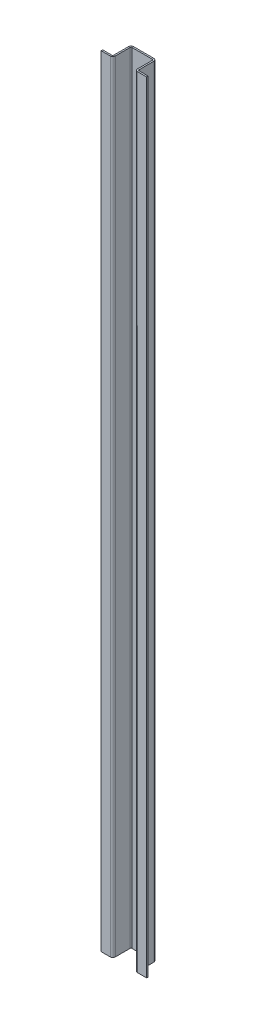
ISO-10303-21;
HEADER;
FILE_DESCRIPTION(('STEP AP214'),'2;1');
FILE_NAME('part.step','',(''),(''),'','','');
FILE_SCHEMA(('AUTOMOTIVE_DESIGN { 1 0 10303 214 1 1 1 1 }'));
ENDSEC;
DATA;
#1=APPLICATION_CONTEXT('core data for automotive mechanical design processes');
#2=APPLICATION_PROTOCOL_DEFINITION('international standard','automotive_design',2000,#1);
#3=PRODUCT_CONTEXT('',#1,'mechanical');
#4=PRODUCT('Part','Part','',(#3));
#5=PRODUCT_RELATED_PRODUCT_CATEGORY('part','',(#4));
#6=PRODUCT_DEFINITION_FORMATION('','',#4);
#7=PRODUCT_DEFINITION_CONTEXT('part definition',#1,'design');
#8=PRODUCT_DEFINITION('design','',#6,#7);
#9=PRODUCT_DEFINITION_SHAPE('','',#8);
#10=(LENGTH_UNIT() NAMED_UNIT(*) SI_UNIT(.MILLI.,.METRE.));
#11=(NAMED_UNIT(*) PLANE_ANGLE_UNIT() SI_UNIT($,.RADIAN.));
#12=(NAMED_UNIT(*) SI_UNIT($,.STERADIAN.) SOLID_ANGLE_UNIT());
#13=UNCERTAINTY_MEASURE_WITH_UNIT(LENGTH_MEASURE(1.E-05),#10,'distance_accuracy_value','');
#14=(GEOMETRIC_REPRESENTATION_CONTEXT(3) GLOBAL_UNCERTAINTY_ASSIGNED_CONTEXT((#13)) GLOBAL_UNIT_ASSIGNED_CONTEXT((#10,
#11,#12)) REPRESENTATION_CONTEXT('',''));
#15=CARTESIAN_POINT('',(0.,0.,0.));
#16=DIRECTION('',(0.,0.,1.));
#17=DIRECTION('',(1.,0.,0.));
#18=AXIS2_PLACEMENT_3D('',#15,#16,#17);
#19=CARTESIAN_POINT('',(-263.,95.4999999999986,-1542.6051229556));
#20=DIRECTION('',(1.,0.,0.));
#21=DIRECTION('',(0.,0.,-1.));
#22=AXIS2_PLACEMENT_3D('',#19,#20,#21);
#23=PLANE('',#22);
#24=DIRECTION('',(0.,0.,1.));
#25=VECTOR('',#24,1.);
#26=CARTESIAN_POINT('',(-263.,865.999999999998,-1542.6051229556));
#27=LINE('',#26,#25);
#28=CARTESIAN_POINT('',(-263.,865.999999999998,-3.00000000000011));
#29=VERTEX_POINT('',#28);
#30=CARTESIAN_POINT('',(-263.,865.999999999998,-1.50000000000061));
#31=VERTEX_POINT('',#30);
#32=EDGE_CURVE('E327',#29,#31,#27,.T.);
#33=ORIENTED_EDGE('',*,*,#32,.T.);
#34=DIRECTION('',(0.,1.,0.));
#35=VECTOR('',#34,1.);
#36=CARTESIAN_POINT('',(-263.,95.4999999999986,-1.50000000000011));
#37=LINE('',#36,#35);
#38=CARTESIAN_POINT('',(-263.,95.4999999999986,-1.50000000000061));
#39=VERTEX_POINT('',#38);
#40=EDGE_CURVE('E81',#39,#31,#37,.T.);
#41=ORIENTED_EDGE('',*,*,#40,.F.);
#42=DIRECTION('',(0.,0.,1.));
#43=VECTOR('',#42,1.);
#44=CARTESIAN_POINT('',(-263.,95.4999999999986,-1542.6051229556));
#45=LINE('',#44,#43);
#46=CARTESIAN_POINT('',(-263.,95.4999999999986,-3.00000000000011));
#47=VERTEX_POINT('',#46);
#48=EDGE_CURVE('E316',#47,#39,#45,.T.);
#49=ORIENTED_EDGE('',*,*,#48,.F.);
#50=DIRECTION('',(0.,1.,0.));
#51=VECTOR('',#50,1.);
#52=CARTESIAN_POINT('',(-263.,95.4999999999986,-3.00000000000011));
#53=LINE('',#52,#51);
#54=EDGE_CURVE('E325',#47,#29,#53,.T.);
#55=ORIENTED_EDGE('',*,*,#54,.T.);
#56=EDGE_LOOP('',(#33,#41,#49,#55));
#57=FACE_BOUND('',#56,.T.);
#58=ADVANCED_FACE('F42',(#57),#23,.T.);
#59=CARTESIAN_POINT('',(-263.,865.999999999999,-1542.6051229556));
#60=DIRECTION('',(0.,-1.,0.));
#61=DIRECTION('',(0.,0.,-1.));
#62=AXIS2_PLACEMENT_3D('',#59,#60,#61);
#63=PLANE('',#62);
#64=DIRECTION('',(1.,0.,0.));
#65=VECTOR('',#64,1.);
#66=CARTESIAN_POINT('',(-263.,865.999999999999,-1.50000000000011));
#67=LINE('',#66,#65);
#68=CARTESIAN_POINT('',(-272.,865.999999999999,-1.50000000000014));
#69=VERTEX_POINT('',#68);
#70=EDGE_CURVE('E74',#31,#69,#67,.F.);
#71=ORIENTED_EDGE('',*,*,#70,.F.);
#72=ORIENTED_EDGE('',*,*,#32,.F.);
#73=DIRECTION('',(1.,0.,0.));
#74=VECTOR('',#73,1.);
#75=CARTESIAN_POINT('',(-263.,865.999999999999,-3.00000000000011));
#76=LINE('',#75,#74);
#77=CARTESIAN_POINT('',(-272.,865.999999999999,-3.00000000000014));
#78=VERTEX_POINT('',#77);
#79=EDGE_CURVE('E11',#78,#29,#76,.T.);
#80=ORIENTED_EDGE('',*,*,#79,.F.);
#81=DIRECTION('',(0.,0.,1.));
#82=VECTOR('',#81,1.);
#83=CARTESIAN_POINT('',(-272.,865.999999999999,-1542.6051229556));
#84=LINE('',#83,#82);
#85=EDGE_CURVE('E323',#78,#69,#84,.T.);
#86=ORIENTED_EDGE('',*,*,#85,.T.);
#87=EDGE_LOOP('',(#71,#72,#80,#86));
#88=FACE_BOUND('',#87,.T.);
#89=ADVANCED_FACE('F337',(#88),#63,.F.);
#90=CARTESIAN_POINT('',(-273.,95.4999999999986,-1.50000000000011));
#91=DIRECTION('',(0.,0.,1.));
#92=DIRECTION('',(1.,0.,0.));
#93=AXIS2_PLACEMENT_3D('',#90,#91,#92);
#94=PLANE('',#93);
#95=ORIENTED_EDGE('',*,*,#70,.T.);
#96=DIRECTION('',(0.,1.,0.));
#97=VECTOR('',#96,1.);
#98=CARTESIAN_POINT('',(-272.,95.4999999999986,-1.50000000000011));
#99=LINE('',#98,#97);
#100=CARTESIAN_POINT('',(-272.,95.4999999999986,-1.50000000000061));
#101=VERTEX_POINT('',#100);
#102=EDGE_CURVE('E319',#69,#101,#99,.F.);
#103=ORIENTED_EDGE('',*,*,#102,.T.);
#104=DIRECTION('',(1.,0.,0.));
#105=VECTOR('',#104,1.);
#106=CARTESIAN_POINT('',(-274.5,95.4999999999986,-1.50000000000011));
#107=LINE('',#106,#105);
#108=EDGE_CURVE('E314',#39,#101,#107,.F.);
#109=ORIENTED_EDGE('',*,*,#108,.F.);
#110=ORIENTED_EDGE('',*,*,#40,.T.);
#111=EDGE_LOOP('',(#95,#103,#109,#110));
#112=FACE_BOUND('',#111,.T.);
#113=ADVANCED_FACE('F339',(#112),#94,.T.);
#114=CARTESIAN_POINT('',(-274.5,95.4999999999986,-1542.6051229556));
#115=DIRECTION('',(0.,-1.,0.));
#116=DIRECTION('',(0.,0.,-1.));
#117=AXIS2_PLACEMENT_3D('',#114,#115,#116);
#118=PLANE('',#117);
#119=ORIENTED_EDGE('',*,*,#48,.T.);
#120=ORIENTED_EDGE('',*,*,#108,.T.);
#121=DIRECTION('',(0.,0.,1.));
#122=VECTOR('',#121,1.);
#123=CARTESIAN_POINT('',(-272.,95.4999999999986,-1542.6051229556));
#124=LINE('',#123,#122);
#125=CARTESIAN_POINT('',(-272.,95.4999999999986,-3.00000000000014));
#126=VERTEX_POINT('',#125);
#127=EDGE_CURVE('E261',#126,#101,#124,.T.);
#128=ORIENTED_EDGE('',*,*,#127,.F.);
#129=DIRECTION('',(1.,0.,0.));
#130=VECTOR('',#129,1.);
#131=CARTESIAN_POINT('',(-274.5,95.4999999999986,-3.00000000000011));
#132=LINE('',#131,#130);
#133=EDGE_CURVE('E52',#126,#47,#132,.T.);
#134=ORIENTED_EDGE('',*,*,#133,.T.);
#135=EDGE_LOOP('',(#119,#120,#128,#134));
#136=FACE_BOUND('',#135,.T.);
#137=ADVANCED_FACE('F335',(#136),#118,.T.);
#138=CARTESIAN_POINT('',(-273.,95.4999999999986,-3.00000000000011));
#139=DIRECTION('',(0.,0.,1.));
#140=DIRECTION('',(1.,0.,0.));
#141=AXIS2_PLACEMENT_3D('',#138,#139,#140);
#142=PLANE('',#141);
#143=ORIENTED_EDGE('',*,*,#54,.F.);
#144=ORIENTED_EDGE('',*,*,#133,.F.);
#145=DIRECTION('',(0.,1.,0.));
#146=VECTOR('',#145,1.);
#147=CARTESIAN_POINT('',(-272.,95.4999999999986,-3.00000000000011));
#148=LINE('',#147,#146);
#149=EDGE_CURVE('E46',#78,#126,#148,.F.);
#150=ORIENTED_EDGE('',*,*,#149,.F.);
#151=ORIENTED_EDGE('',*,*,#79,.T.);
#152=EDGE_LOOP('',(#143,#144,#150,#151));
#153=FACE_BOUND('',#152,.T.);
#154=ADVANCED_FACE('F44',(#153),#142,.F.);
#155=CARTESIAN_POINT('',(-308.,95.4999999999986,-1542.6051229556));
#156=DIRECTION('',(-1.,0.,0.));
#157=DIRECTION('',(0.,0.,1.));
#158=AXIS2_PLACEMENT_3D('',#155,#156,#157);
#159=PLANE('',#158);
#160=DIRECTION('',(0.,0.,1.));
#161=VECTOR('',#160,1.);
#162=CARTESIAN_POINT('',(-308.,95.4999999999986,-1542.6051229556));
#163=LINE('',#162,#161);
#164=CARTESIAN_POINT('',(-308.,95.4999999999986,-3.00000000000011));
#165=VERTEX_POINT('',#164);
#166=CARTESIAN_POINT('',(-308.,95.4999999999986,-1.50000000000061));
#167=VERTEX_POINT('',#166);
#168=EDGE_CURVE('E306',#165,#167,#163,.T.);
#169=ORIENTED_EDGE('',*,*,#168,.T.);
#170=DIRECTION('',(0.,1.,0.));
#171=VECTOR('',#170,1.);
#172=CARTESIAN_POINT('',(-308.,95.4999999999986,-1.50000000000011));
#173=LINE('',#172,#171);
#174=CARTESIAN_POINT('',(-308.,865.999999999998,-1.50000000000011));
#175=VERTEX_POINT('',#174);
#176=EDGE_CURVE('E293',#175,#167,#173,.F.);
#177=ORIENTED_EDGE('',*,*,#176,.F.);
#178=DIRECTION('',(0.,0.,1.));
#179=VECTOR('',#178,1.);
#180=CARTESIAN_POINT('',(-308.,865.999999999998,-1542.6051229556));
#181=LINE('',#180,#179);
#182=CARTESIAN_POINT('',(-308.,865.999999999998,-3.00000000000045));
#183=VERTEX_POINT('',#182);
#184=EDGE_CURVE('E288',#183,#175,#181,.T.);
#185=ORIENTED_EDGE('',*,*,#184,.F.);
#186=DIRECTION('',(0.,1.,0.));
#187=VECTOR('',#186,1.);
#188=CARTESIAN_POINT('',(-308.,95.4999999999986,-3.00000000000011));
#189=LINE('',#188,#187);
#190=EDGE_CURVE('E90',#183,#165,#189,.F.);
#191=ORIENTED_EDGE('',*,*,#190,.T.);
#192=EDGE_LOOP('',(#169,#177,#185,#191));
#193=FACE_BOUND('',#192,.T.);
#194=ADVANCED_FACE('F366',(#193),#159,.T.);
#195=CARTESIAN_POINT('',(-274.5,95.4999999999986,-1542.6051229556));
#196=DIRECTION('',(0.,-1.,0.));
#197=DIRECTION('',(0.,0.,-1.));
#198=AXIS2_PLACEMENT_3D('',#195,#196,#197);
#199=PLANE('',#198);
#200=DIRECTION('',(0.,0.,1.));
#201=VECTOR('',#200,1.);
#202=CARTESIAN_POINT('',(-299.,95.4999999999986,-1542.6051229556));
#203=LINE('',#202,#201);
#204=CARTESIAN_POINT('',(-299.,95.4999999999986,-3.00000000000011));
#205=VERTEX_POINT('',#204);
#206=CARTESIAN_POINT('',(-299.,95.4999999999986,-1.50000000000011));
#207=VERTEX_POINT('',#206);
#208=EDGE_CURVE('E303',#205,#207,#203,.T.);
#209=ORIENTED_EDGE('',*,*,#208,.T.);
#210=DIRECTION('',(1.,0.,0.));
#211=VECTOR('',#210,1.);
#212=CARTESIAN_POINT('',(-274.5,95.4999999999986,-1.50000000000011));
#213=LINE('',#212,#211);
#214=EDGE_CURVE('E113',#207,#167,#213,.F.);
#215=ORIENTED_EDGE('',*,*,#214,.T.);
#216=ORIENTED_EDGE('',*,*,#168,.F.);
#217=DIRECTION('',(1.,0.,0.));
#218=VECTOR('',#217,1.);
#219=CARTESIAN_POINT('',(-274.5,95.4999999999986,-3.00000000000011));
#220=LINE('',#219,#218);
#221=EDGE_CURVE('E299',#165,#205,#220,.T.);
#222=ORIENTED_EDGE('',*,*,#221,.T.);
#223=EDGE_LOOP('',(#209,#215,#216,#222));
#224=FACE_BOUND('',#223,.T.);
#225=ADVANCED_FACE('F362',(#224),#199,.T.);
#226=CARTESIAN_POINT('',(-308.,95.4999999999986,-1.50000000000011));
#227=DIRECTION('',(0.,0.,1.));
#228=DIRECTION('',(1.,0.,0.));
#229=AXIS2_PLACEMENT_3D('',#226,#227,#228);
#230=PLANE('',#229);
#231=DIRECTION('',(1.,0.,0.));
#232=VECTOR('',#231,1.);
#233=CARTESIAN_POINT('',(-263.,865.999999999999,-1.50000000000011));
#234=LINE('',#233,#232);
#235=CARTESIAN_POINT('',(-299.,865.999999999999,-1.50000000000061));
#236=VERTEX_POINT('',#235);
#237=EDGE_CURVE('E296',#236,#175,#234,.F.);
#238=ORIENTED_EDGE('',*,*,#237,.T.);
#239=ORIENTED_EDGE('',*,*,#176,.T.);
#240=ORIENTED_EDGE('',*,*,#214,.F.);
#241=DIRECTION('',(0.,1.,0.));
#242=VECTOR('',#241,1.);
#243=CARTESIAN_POINT('',(-299.,95.4999999999986,-1.50000000000011));
#244=LINE('',#243,#242);
#245=EDGE_CURVE('E290',#207,#236,#244,.T.);
#246=ORIENTED_EDGE('',*,*,#245,.T.);
#247=EDGE_LOOP('',(#238,#239,#240,#246));
#248=FACE_BOUND('',#247,.T.);
#249=ADVANCED_FACE('F358',(#248),#230,.T.);
#250=CARTESIAN_POINT('',(-263.,865.999999999999,-1542.6051229556));
#251=DIRECTION('',(0.,-1.,0.));
#252=DIRECTION('',(0.,0.,-1.));
#253=AXIS2_PLACEMENT_3D('',#250,#251,#252);
#254=PLANE('',#253);
#255=ORIENTED_EDGE('',*,*,#237,.F.);
#256=DIRECTION('',(0.,0.,1.));
#257=VECTOR('',#256,1.);
#258=CARTESIAN_POINT('',(-299.,865.999999999999,-1542.6051229556));
#259=LINE('',#258,#257);
#260=CARTESIAN_POINT('',(-299.,865.999999999998,-3.00000000000011));
#261=VERTEX_POINT('',#260);
#262=EDGE_CURVE('E308',#261,#236,#259,.T.);
#263=ORIENTED_EDGE('',*,*,#262,.F.);
#264=DIRECTION('',(1.,0.,0.));
#265=VECTOR('',#264,1.);
#266=CARTESIAN_POINT('',(-263.,865.999999999999,-3.00000000000011));
#267=LINE('',#266,#265);
#268=EDGE_CURVE('E286',#183,#261,#267,.T.);
#269=ORIENTED_EDGE('',*,*,#268,.F.);
#270=ORIENTED_EDGE('',*,*,#184,.T.);
#271=EDGE_LOOP('',(#255,#263,#269,#270));
#272=FACE_BOUND('',#271,.T.);
#273=ADVANCED_FACE('F355',(#272),#254,.F.);
#274=CARTESIAN_POINT('',(-308.,95.4999999999986,-3.00000000000011));
#275=DIRECTION('',(0.,0.,1.));
#276=DIRECTION('',(1.,0.,0.));
#277=AXIS2_PLACEMENT_3D('',#274,#275,#276);
#278=PLANE('',#277);
#279=DIRECTION('',(0.,1.,0.));
#280=VECTOR('',#279,1.);
#281=CARTESIAN_POINT('',(-299.,95.4999999999986,-3.00000000000011));
#282=LINE('',#281,#280);
#283=EDGE_CURVE('E253',#205,#261,#282,.T.);
#284=ORIENTED_EDGE('',*,*,#283,.F.);
#285=ORIENTED_EDGE('',*,*,#221,.F.);
#286=ORIENTED_EDGE('',*,*,#190,.F.);
#287=ORIENTED_EDGE('',*,*,#268,.T.);
#288=EDGE_LOOP('',(#284,#285,#286,#287));
#289=FACE_BOUND('',#288,.T.);
#290=ADVANCED_FACE('F352',(#289),#278,.F.);
#291=CARTESIAN_POINT('',(-1815.77285060109,95.4999999999986,-18.5));
#292=DIRECTION('',(0.,-1.,0.));
#293=DIRECTION('',(1.,0.,0.));
#294=AXIS2_PLACEMENT_3D('',#291,#292,#293);
#295=PLANE('',#294);
#296=DIRECTION('',(0.,0.,-1.));
#297=VECTOR('',#296,1.);
#298=CARTESIAN_POINT('',(-273.,95.4999999999986,-18.5000000000001));
#299=LINE('',#298,#297);
#300=CARTESIAN_POINT('',(-273.,95.4999999999986,-18.5));
#301=VERTEX_POINT('',#300);
#302=CARTESIAN_POINT('',(-273.,95.4999999999986,-4.00000000000008));
#303=VERTEX_POINT('',#302);
#304=EDGE_CURVE('E267',#301,#303,#299,.F.);
#305=ORIENTED_EDGE('',*,*,#304,.T.);
#306=DIRECTION('',(1.,0.,0.));
#307=VECTOR('',#306,1.);
#308=CARTESIAN_POINT('',(-1815.77285060109,95.4999999999986,-4.));
#309=LINE('',#308,#307);
#310=CARTESIAN_POINT('',(-274.5,95.4999999999986,-4.00000000000003));
#311=VERTEX_POINT('',#310);
#312=EDGE_CURVE('E258',#311,#303,#309,.T.);
#313=ORIENTED_EDGE('',*,*,#312,.F.);
#314=DIRECTION('',(0.,0.,-1.));
#315=VECTOR('',#314,1.);
#316=CARTESIAN_POINT('',(-274.5,95.4999999999986,-18.5000000000001));
#317=LINE('',#316,#315);
#318=CARTESIAN_POINT('',(-274.5,95.4999999999986,-18.5));
#319=VERTEX_POINT('',#318);
#320=EDGE_CURVE('E143',#311,#319,#317,.T.);
#321=ORIENTED_EDGE('',*,*,#320,.T.);
#322=DIRECTION('',(1.,0.,0.));
#323=VECTOR('',#322,1.);
#324=CARTESIAN_POINT('',(-1815.77285060109,95.4999999999986,-18.5));
#325=LINE('',#324,#323);
#326=EDGE_CURVE('E273',#319,#301,#325,.T.);
#327=ORIENTED_EDGE('',*,*,#326,.T.);
#328=EDGE_LOOP('',(#305,#313,#321,#327));
#329=FACE_BOUND('',#328,.T.);
#330=ADVANCED_FACE('F265',(#329),#295,.T.);
#331=CARTESIAN_POINT('',(-273.,95.4999999999986,-21.0000000000001));
#332=DIRECTION('',(-1.,0.,0.));
#333=DIRECTION('',(0.,0.,1.));
#334=AXIS2_PLACEMENT_3D('',#331,#332,#333);
#335=PLANE('',#334);
#336=DIRECTION('',(0.,1.,0.));
#337=VECTOR('',#336,1.);
#338=CARTESIAN_POINT('',(-273.,95.4999999999986,-4.00000000000006));
#339=LINE('',#338,#337);
#340=CARTESIAN_POINT('',(-273.,865.999999999999,-4.00000000000006));
#341=VERTEX_POINT('',#340);
#342=EDGE_CURVE('E268',#303,#341,#339,.T.);
#343=ORIENTED_EDGE('',*,*,#342,.F.);
#344=ORIENTED_EDGE('',*,*,#304,.F.);
#345=DIRECTION('',(0.,1.,0.));
#346=VECTOR('',#345,1.);
#347=CARTESIAN_POINT('',(-273.,95.4999999999986,-18.5000000000001));
#348=LINE('',#347,#346);
#349=CARTESIAN_POINT('',(-273.,865.999999999999,-18.5000000000001));
#350=VERTEX_POINT('',#349);
#351=EDGE_CURVE('E281',#350,#301,#348,.F.);
#352=ORIENTED_EDGE('',*,*,#351,.F.);
#353=DIRECTION('',(0.,0.,-1.));
#354=VECTOR('',#353,1.);
#355=CARTESIAN_POINT('',(-273.,865.999999999999,62.1396103067893));
#356=LINE('',#355,#354);
#357=EDGE_CURVE('E275',#350,#341,#356,.F.);
#358=ORIENTED_EDGE('',*,*,#357,.T.);
#359=EDGE_LOOP('',(#343,#344,#352,#358));
#360=FACE_BOUND('',#359,.T.);
#361=ADVANCED_FACE('F376',(#360),#335,.F.);
#362=CARTESIAN_POINT('',(-1815.77285060109,865.999999999999,62.1396103067892));
#363=DIRECTION('',(0.,-1.,0.));
#364=DIRECTION('',(1.,0.,0.));
#365=AXIS2_PLACEMENT_3D('',#362,#363,#364);
#366=PLANE('',#365);
#367=DIRECTION('',(1.,0.,0.));
#368=VECTOR('',#367,1.);
#369=CARTESIAN_POINT('',(-1815.77285060109,865.999999999999,-4.));
#370=LINE('',#369,#368);
#371=CARTESIAN_POINT('',(-274.5,865.999999999999,-4.00000000000003));
#372=VERTEX_POINT('',#371);
#373=EDGE_CURVE('E945',#372,#341,#370,.T.);
#374=ORIENTED_EDGE('',*,*,#373,.T.);
#375=ORIENTED_EDGE('',*,*,#357,.F.);
#376=DIRECTION('',(1.,0.,0.));
#377=VECTOR('',#376,1.);
#378=CARTESIAN_POINT('',(-1815.77285060109,865.999999999999,-18.5));
#379=LINE('',#378,#377);
#380=CARTESIAN_POINT('',(-274.5,865.999999999999,-18.5000000000001));
#381=VERTEX_POINT('',#380);
#382=EDGE_CURVE('E135',#381,#350,#379,.T.);
#383=ORIENTED_EDGE('',*,*,#382,.F.);
#384=DIRECTION('',(0.,0.,-1.));
#385=VECTOR('',#384,1.);
#386=CARTESIAN_POINT('',(-274.5,865.999999999999,62.1396103067893));
#387=LINE('',#386,#385);
#388=EDGE_CURVE('E943',#372,#381,#387,.T.);
#389=ORIENTED_EDGE('',*,*,#388,.F.);
#390=EDGE_LOOP('',(#374,#375,#383,#389));
#391=FACE_BOUND('',#390,.T.);
#392=ADVANCED_FACE('F373',(#391),#366,.F.);
#393=CARTESIAN_POINT('',(-274.5,95.4999999999986,-21.0000000000001));
#394=DIRECTION('',(-1.,0.,0.));
#395=DIRECTION('',(0.,0.,1.));
#396=AXIS2_PLACEMENT_3D('',#393,#394,#395);
#397=PLANE('',#396);
#398=ORIENTED_EDGE('',*,*,#388,.T.);
#399=DIRECTION('',(0.,1.,0.));
#400=VECTOR('',#399,1.);
#401=CARTESIAN_POINT('',(-274.5,95.4999999999986,-18.5000000000001));
#402=LINE('',#401,#400);
#403=EDGE_CURVE('E254',#381,#319,#402,.F.);
#404=ORIENTED_EDGE('',*,*,#403,.T.);
#405=ORIENTED_EDGE('',*,*,#320,.F.);
#406=DIRECTION('',(0.,1.,0.));
#407=VECTOR('',#406,1.);
#408=CARTESIAN_POINT('',(-274.5,95.4999999999986,-4.00000000000006));
#409=LINE('',#408,#407);
#410=EDGE_CURVE('E245',#311,#372,#409,.T.);
#411=ORIENTED_EDGE('',*,*,#410,.T.);
#412=EDGE_LOOP('',(#398,#404,#405,#411));
#413=FACE_BOUND('',#412,.T.);
#414=ADVANCED_FACE('F270',(#413),#397,.T.);
#415=CARTESIAN_POINT('',(1244.77285060109,865.999999999999,62.1396103067893));
#416=DIRECTION('',(0.,-1.,0.));
#417=DIRECTION('',(-1.,0.,0.));
#418=AXIS2_PLACEMENT_3D('',#415,#416,#417);
#419=PLANE('',#418);
#420=DIRECTION('',(-1.,0.,0.));
#421=VECTOR('',#420,1.);
#422=CARTESIAN_POINT('',(1244.77285060109,865.999999999999,-18.5));
#423=LINE('',#422,#421);
#424=CARTESIAN_POINT('',(-296.5,865.999999999999,-18.5000000000001));
#425=VERTEX_POINT('',#424);
#426=CARTESIAN_POINT('',(-298.,865.999999999999,-18.5000000000001));
#427=VERTEX_POINT('',#426);
#428=EDGE_CURVE('E933',#425,#427,#423,.T.);
#429=ORIENTED_EDGE('',*,*,#428,.T.);
#430=DIRECTION('',(0.,0.,-1.));
#431=VECTOR('',#430,1.);
#432=CARTESIAN_POINT('',(-298.,865.999999999999,62.1396103067892));
#433=LINE('',#432,#431);
#434=CARTESIAN_POINT('',(-298.,865.999999999998,-4.00000000000011));
#435=VERTEX_POINT('',#434);
#436=EDGE_CURVE('E930',#435,#427,#433,.T.);
#437=ORIENTED_EDGE('',*,*,#436,.F.);
#438=DIRECTION('',(-1.,0.,0.));
#439=VECTOR('',#438,1.);
#440=CARTESIAN_POINT('',(1244.77285060109,865.999999999999,-4.00000000000006));
#441=LINE('',#440,#439);
#442=CARTESIAN_POINT('',(-296.5,865.999999999998,-4.00000000000011));
#443=VERTEX_POINT('',#442);
#444=EDGE_CURVE('E935',#443,#435,#441,.T.);
#445=ORIENTED_EDGE('',*,*,#444,.F.);
#446=DIRECTION('',(0.,0.,-1.));
#447=VECTOR('',#446,1.);
#448=CARTESIAN_POINT('',(-296.5,865.999999999999,62.1396103067892));
#449=LINE('',#448,#447);
#450=EDGE_CURVE('E172',#425,#443,#449,.F.);
#451=ORIENTED_EDGE('',*,*,#450,.F.);
#452=EDGE_LOOP('',(#429,#437,#445,#451));
#453=FACE_BOUND('',#452,.T.);
#454=ADVANCED_FACE('F372',(#453),#419,.F.);
#455=CARTESIAN_POINT('',(-298.,95.4999999999986,-3.00000000000011));
#456=DIRECTION('',(1.,0.,0.));
#457=DIRECTION('',(0.,0.,-1.));
#458=AXIS2_PLACEMENT_3D('',#455,#456,#457);
#459=PLANE('',#458);
#460=DIRECTION('',(0.,1.,0.));
#461=VECTOR('',#460,1.);
#462=CARTESIAN_POINT('',(-298.,95.4999999999986,-18.5000000000001));
#463=LINE('',#462,#461);
#464=CARTESIAN_POINT('',(-298.,95.4999999999986,-18.5000000000001));
#465=VERTEX_POINT('',#464);
#466=EDGE_CURVE('E938',#465,#427,#463,.T.);
#467=ORIENTED_EDGE('',*,*,#466,.F.);
#468=DIRECTION('',(0.,0.,-1.));
#469=VECTOR('',#468,1.);
#470=CARTESIAN_POINT('',(-298.,95.4999999999986,-18.5000000000001));
#471=LINE('',#470,#469);
#472=CARTESIAN_POINT('',(-298.,95.4999999999986,-4.00000000000011));
#473=VERTEX_POINT('',#472);
#474=EDGE_CURVE('E928',#473,#465,#471,.T.);
#475=ORIENTED_EDGE('',*,*,#474,.F.);
#476=DIRECTION('',(0.,1.,0.));
#477=VECTOR('',#476,1.);
#478=CARTESIAN_POINT('',(-298.,95.4999999999986,-4.00000000000011));
#479=LINE('',#478,#477);
#480=EDGE_CURVE('E863',#435,#473,#479,.F.);
#481=ORIENTED_EDGE('',*,*,#480,.F.);
#482=ORIENTED_EDGE('',*,*,#436,.T.);
#483=EDGE_LOOP('',(#467,#475,#481,#482));
#484=FACE_BOUND('',#483,.T.);
#485=ADVANCED_FACE('F390',(#484),#459,.F.);
#486=CARTESIAN_POINT('',(1244.77285060109,95.4999999999986,-18.5));
#487=DIRECTION('',(0.,-1.,0.));
#488=DIRECTION('',(-1.,0.,0.));
#489=AXIS2_PLACEMENT_3D('',#486,#487,#488);
#490=PLANE('',#489);
#491=ORIENTED_EDGE('',*,*,#474,.T.);
#492=DIRECTION('',(-1.,0.,0.));
#493=VECTOR('',#492,1.);
#494=CARTESIAN_POINT('',(1244.77285060109,95.4999999999986,-18.5));
#495=LINE('',#494,#493);
#496=CARTESIAN_POINT('',(-296.5,95.4999999999986,-18.5000000000001));
#497=VERTEX_POINT('',#496);
#498=EDGE_CURVE('E165',#497,#465,#495,.T.);
#499=ORIENTED_EDGE('',*,*,#498,.F.);
#500=DIRECTION('',(0.,0.,-1.));
#501=VECTOR('',#500,1.);
#502=CARTESIAN_POINT('',(-296.5,95.4999999999986,-18.5000000000001));
#503=LINE('',#502,#501);
#504=CARTESIAN_POINT('',(-296.5,95.4999999999986,-4.00000000000011));
#505=VERTEX_POINT('',#504);
#506=EDGE_CURVE('E926',#497,#505,#503,.F.);
#507=ORIENTED_EDGE('',*,*,#506,.T.);
#508=DIRECTION('',(-1.,0.,0.));
#509=VECTOR('',#508,1.);
#510=CARTESIAN_POINT('',(1244.77285060109,95.4999999999986,-4.00000000000006));
#511=LINE('',#510,#509);
#512=EDGE_CURVE('E923',#505,#473,#511,.T.);
#513=ORIENTED_EDGE('',*,*,#512,.T.);
#514=EDGE_LOOP('',(#491,#499,#507,#513));
#515=FACE_BOUND('',#514,.T.);
#516=ADVANCED_FACE('F386',(#515),#490,.T.);
#517=CARTESIAN_POINT('',(-296.5,95.4999999999986,-3.00000000000011));
#518=DIRECTION('',(1.,0.,0.));
#519=DIRECTION('',(0.,0.,-1.));
#520=AXIS2_PLACEMENT_3D('',#517,#518,#519);
#521=PLANE('',#520);
#522=ORIENTED_EDGE('',*,*,#450,.T.);
#523=DIRECTION('',(0.,1.,0.));
#524=VECTOR('',#523,1.);
#525=CARTESIAN_POINT('',(-296.5,95.4999999999986,-4.00000000000011));
#526=LINE('',#525,#524);
#527=EDGE_CURVE('E919',#443,#505,#526,.F.);
#528=ORIENTED_EDGE('',*,*,#527,.T.);
#529=ORIENTED_EDGE('',*,*,#506,.F.);
#530=DIRECTION('',(0.,1.,0.));
#531=VECTOR('',#530,1.);
#532=CARTESIAN_POINT('',(-296.5,95.4999999999986,-18.5000000000001));
#533=LINE('',#532,#531);
#534=EDGE_CURVE('E285',#497,#425,#533,.T.);
#535=ORIENTED_EDGE('',*,*,#534,.T.);
#536=EDGE_LOOP('',(#522,#528,#529,#535));
#537=FACE_BOUND('',#536,.T.);
#538=ADVANCED_FACE('F382',(#537),#521,.T.);
#539=CARTESIAN_POINT('',(-298.,95.4999999999986,-21.));
#540=DIRECTION('',(0.,0.,1.));
#541=DIRECTION('',(1.,0.,0.));
#542=AXIS2_PLACEMENT_3D('',#539,#540,#541);
#543=PLANE('',#542);
#544=DIRECTION('',(0.,1.,0.));
#545=VECTOR('',#544,1.);
#546=CARTESIAN_POINT('',(-275.5,95.4999999999986,-21.));
#547=LINE('',#546,#545);
#548=CARTESIAN_POINT('',(-275.5,95.4999999999986,-21.));
#549=VERTEX_POINT('',#548);
#550=CARTESIAN_POINT('',(-275.5,865.999999999999,-21.));
#551=VERTEX_POINT('',#550);
#552=EDGE_CURVE('E188',#549,#551,#547,.T.);
#553=ORIENTED_EDGE('',*,*,#552,.F.);
#554=DIRECTION('',(1.,0.,0.));
#555=VECTOR('',#554,1.);
#556=CARTESIAN_POINT('',(-274.5,95.4999999999986,-21.));
#557=LINE('',#556,#555);
#558=CARTESIAN_POINT('',(-295.5,95.4999999999986,-21.));
#559=VERTEX_POINT('',#558);
#560=EDGE_CURVE('E889',#559,#549,#557,.T.);
#561=ORIENTED_EDGE('',*,*,#560,.F.);
#562=DIRECTION('',(0.,1.,0.));
#563=VECTOR('',#562,1.);
#564=CARTESIAN_POINT('',(-295.5,95.4999999999986,-21.));
#565=LINE('',#564,#563);
#566=CARTESIAN_POINT('',(-295.5,865.999999999999,-21.));
#567=VERTEX_POINT('',#566);
#568=EDGE_CURVE('E180',#567,#559,#565,.F.);
#569=ORIENTED_EDGE('',*,*,#568,.F.);
#570=DIRECTION('',(1.,0.,0.));
#571=VECTOR('',#570,1.);
#572=CARTESIAN_POINT('',(-263.,865.999999999999,-21.));
#573=LINE('',#572,#571);
#574=EDGE_CURVE('E893',#567,#551,#573,.T.);
#575=ORIENTED_EDGE('',*,*,#574,.T.);
#576=EDGE_LOOP('',(#553,#561,#569,#575));
#577=FACE_BOUND('',#576,.T.);
#578=ADVANCED_FACE('F385',(#577),#543,.F.);
#579=CARTESIAN_POINT('',(-298.,865.999999999999,1522.01905599639));
#580=DIRECTION('',(0.,-1.,0.));
#581=DIRECTION('',(0.,0.,-1.));
#582=AXIS2_PLACEMENT_3D('',#579,#580,#581);
#583=PLANE('',#582);
#584=DIRECTION('',(0.,0.,-1.));
#585=VECTOR('',#584,1.);
#586=CARTESIAN_POINT('',(-275.5,865.999999999999,1522.01905599639));
#587=LINE('',#586,#585);
#588=CARTESIAN_POINT('',(-275.5,865.999999999999,-19.5));
#589=VERTEX_POINT('',#588);
#590=EDGE_CURVE('E908',#589,#551,#587,.T.);
#591=ORIENTED_EDGE('',*,*,#590,.T.);
#592=ORIENTED_EDGE('',*,*,#574,.F.);
#593=DIRECTION('',(0.,0.,-1.));
#594=VECTOR('',#593,1.);
#595=CARTESIAN_POINT('',(-295.5,865.999999999999,1522.01905599639));
#596=LINE('',#595,#594);
#597=CARTESIAN_POINT('',(-295.5,865.999999999999,-19.5));
#598=VERTEX_POINT('',#597);
#599=EDGE_CURVE('E916',#598,#567,#596,.T.);
#600=ORIENTED_EDGE('',*,*,#599,.F.);
#601=DIRECTION('',(1.,0.,0.));
#602=VECTOR('',#601,1.);
#603=CARTESIAN_POINT('',(-298.,865.999999999999,-19.5));
#604=LINE('',#603,#602);
#605=EDGE_CURVE('E896',#589,#598,#604,.F.);
#606=ORIENTED_EDGE('',*,*,#605,.F.);
#607=EDGE_LOOP('',(#591,#592,#600,#606));
#608=FACE_BOUND('',#607,.T.);
#609=ADVANCED_FACE('F396',(#608),#583,.F.);
#610=CARTESIAN_POINT('',(-298.,95.4999999999986,1522.01905599639));
#611=DIRECTION('',(0.,1.,0.));
#612=DIRECTION('',(0.,0.,1.));
#613=AXIS2_PLACEMENT_3D('',#610,#611,#612);
#614=PLANE('',#613);
#615=DIRECTION('',(0.,0.,-1.));
#616=VECTOR('',#615,1.);
#617=CARTESIAN_POINT('',(-295.5,95.4999999999986,1522.01905599639));
#618=LINE('',#617,#616);
#619=CARTESIAN_POINT('',(-295.5,95.4999999999986,-19.5));
#620=VERTEX_POINT('',#619);
#621=EDGE_CURVE('E913',#620,#559,#618,.T.);
#622=ORIENTED_EDGE('',*,*,#621,.T.);
#623=ORIENTED_EDGE('',*,*,#560,.T.);
#624=DIRECTION('',(0.,0.,-1.));
#625=VECTOR('',#624,1.);
#626=CARTESIAN_POINT('',(-275.5,95.4999999999986,1522.01905599639));
#627=LINE('',#626,#625);
#628=CARTESIAN_POINT('',(-275.5,95.4999999999986,-19.5));
#629=VERTEX_POINT('',#628);
#630=EDGE_CURVE('E911',#629,#549,#627,.T.);
#631=ORIENTED_EDGE('',*,*,#630,.F.);
#632=DIRECTION('',(1.,0.,0.));
#633=VECTOR('',#632,1.);
#634=CARTESIAN_POINT('',(-298.,95.4999999999986,-19.5));
#635=LINE('',#634,#633);
#636=EDGE_CURVE('E902',#620,#629,#635,.T.);
#637=ORIENTED_EDGE('',*,*,#636,.F.);
#638=EDGE_LOOP('',(#622,#623,#631,#637));
#639=FACE_BOUND('',#638,.T.);
#640=ADVANCED_FACE('F399',(#639),#614,.F.);
#641=CARTESIAN_POINT('',(-298.,95.4999999999986,-19.5));
#642=DIRECTION('',(0.,0.,1.));
#643=DIRECTION('',(1.,0.,0.));
#644=AXIS2_PLACEMENT_3D('',#641,#642,#643);
#645=PLANE('',#644);
#646=ORIENTED_EDGE('',*,*,#605,.T.);
#647=DIRECTION('',(0.,1.,0.));
#648=VECTOR('',#647,1.);
#649=CARTESIAN_POINT('',(-295.5,95.4999999999986,-19.5));
#650=LINE('',#649,#648);
#651=EDGE_CURVE('E899',#598,#620,#650,.F.);
#652=ORIENTED_EDGE('',*,*,#651,.T.);
#653=ORIENTED_EDGE('',*,*,#636,.T.);
#654=DIRECTION('',(0.,1.,0.));
#655=VECTOR('',#654,1.);
#656=CARTESIAN_POINT('',(-275.5,95.4999999999986,-19.5));
#657=LINE('',#656,#655);
#658=EDGE_CURVE('E905',#629,#589,#657,.T.);
#659=ORIENTED_EDGE('',*,*,#658,.T.);
#660=EDGE_LOOP('',(#646,#652,#653,#659));
#661=FACE_BOUND('',#660,.T.);
#662=ADVANCED_FACE('F403',(#661),#645,.T.);
#663=CARTESIAN_POINT('',(-295.5,95.4999999999986,-18.5));
#664=DIRECTION('',(0.,-1.,0.));
#665=DIRECTION('',(0.,0.,-1.));
#666=AXIS2_PLACEMENT_3D('',#663,#664,#665);
#667=PLANE('',#666);
#668=ORIENTED_EDGE('',*,*,#621,.F.);
#669=CARTESIAN_POINT('',(-295.5,95.4999999999986,-18.5));
#670=DIRECTION('',(0.,-1.,0.));
#671=DIRECTION('',(0.,0.,-1.));
#672=AXIS2_PLACEMENT_3D('',#669,#670,#671);
#673=CIRCLE('',#672,1.);
#674=EDGE_CURVE('E883',#620,#497,#673,.F.);
#675=ORIENTED_EDGE('',*,*,#674,.T.);
#676=ORIENTED_EDGE('',*,*,#498,.T.);
#677=CARTESIAN_POINT('',(-295.5,95.4999999999986,-18.5));
#678=DIRECTION('',(0.,-1.,0.));
#679=DIRECTION('',(0.,0.,-1.));
#680=AXIS2_PLACEMENT_3D('',#677,#678,#679);
#681=CIRCLE('',#680,2.5);
#682=EDGE_CURVE('E882',#559,#465,#681,.F.);
#683=ORIENTED_EDGE('',*,*,#682,.F.);
#684=EDGE_LOOP('',(#668,#675,#676,#683));
#685=FACE_BOUND('',#684,.T.);
#686=ADVANCED_FACE('F407',(#685),#667,.T.);
#687=CARTESIAN_POINT('',(-295.5,865.999999999999,-18.5));
#688=DIRECTION('',(0.,1.,0.));
#689=DIRECTION('',(0.,0.,1.));
#690=AXIS2_PLACEMENT_3D('',#687,#688,#689);
#691=PLANE('',#690);
#692=ORIENTED_EDGE('',*,*,#428,.F.);
#693=CARTESIAN_POINT('',(-295.5,865.999999999999,-18.5));
#694=DIRECTION('',(0.,-1.,0.));
#695=DIRECTION('',(0.,0.,-1.));
#696=AXIS2_PLACEMENT_3D('',#693,#694,#695);
#697=CIRCLE('',#696,1.);
#698=EDGE_CURVE('E875',#425,#598,#697,.T.);
#699=ORIENTED_EDGE('',*,*,#698,.T.);
#700=ORIENTED_EDGE('',*,*,#599,.T.);
#701=CARTESIAN_POINT('',(-295.5,865.999999999999,-18.5));
#702=DIRECTION('',(0.,-1.,0.));
#703=DIRECTION('',(0.,0.,-1.));
#704=AXIS2_PLACEMENT_3D('',#701,#702,#703);
#705=CIRCLE('',#704,2.5);
#706=EDGE_CURVE('E880',#427,#567,#705,.T.);
#707=ORIENTED_EDGE('',*,*,#706,.F.);
#708=EDGE_LOOP('',(#692,#699,#700,#707));
#709=FACE_BOUND('',#708,.T.);
#710=ADVANCED_FACE('F414',(#709),#691,.T.);
#711=CARTESIAN_POINT('',(-295.5,1640.33939587238,-18.5));
#712=DIRECTION('',(0.,-1.,0.));
#713=DIRECTION('',(0.,0.,-1.));
#714=AXIS2_PLACEMENT_3D('',#711,#712,#713);
#715=CYLINDRICAL_SURFACE('',#714,2.5);
#716=ORIENTED_EDGE('',*,*,#706,.T.);
#717=ORIENTED_EDGE('',*,*,#568,.T.);
#718=ORIENTED_EDGE('',*,*,#682,.T.);
#719=ORIENTED_EDGE('',*,*,#466,.T.);
#720=EDGE_LOOP('',(#716,#717,#718,#719));
#721=FACE_BOUND('',#720,.T.);
#722=ADVANCED_FACE('F418',(#721),#715,.T.);
#723=CARTESIAN_POINT('',(-295.5,1640.33939587238,-18.5));
#724=DIRECTION('',(0.,-1.,0.));
#725=DIRECTION('',(0.,0.,-1.));
#726=AXIS2_PLACEMENT_3D('',#723,#724,#725);
#727=CYLINDRICAL_SURFACE('',#726,1.);
#728=ORIENTED_EDGE('',*,*,#698,.F.);
#729=ORIENTED_EDGE('',*,*,#534,.F.);
#730=ORIENTED_EDGE('',*,*,#674,.F.);
#731=ORIENTED_EDGE('',*,*,#651,.F.);
#732=EDGE_LOOP('',(#728,#729,#730,#731));
#733=FACE_BOUND('',#732,.T.);
#734=ADVANCED_FACE('F420',(#733),#727,.F.);
#735=CARTESIAN_POINT('',(-275.5,865.999999999999,-18.5));
#736=DIRECTION('',(0.,1.,0.));
#737=DIRECTION('',(0.,0.,1.));
#738=AXIS2_PLACEMENT_3D('',#735,#736,#737);
#739=PLANE('',#738);
#740=ORIENTED_EDGE('',*,*,#590,.F.);
#741=CARTESIAN_POINT('',(-275.5,865.999999999999,-18.5));
#742=DIRECTION('',(0.,1.,0.));
#743=DIRECTION('',(0.,0.,1.));
#744=AXIS2_PLACEMENT_3D('',#741,#742,#743);
#745=CIRCLE('',#744,1.);
#746=EDGE_CURVE('E873',#589,#381,#745,.F.);
#747=ORIENTED_EDGE('',*,*,#746,.T.);
#748=ORIENTED_EDGE('',*,*,#382,.T.);
#749=CARTESIAN_POINT('',(-275.5,865.999999999999,-18.5));
#750=DIRECTION('',(0.,1.,0.));
#751=DIRECTION('',(0.,0.,1.));
#752=AXIS2_PLACEMENT_3D('',#749,#750,#751);
#753=CIRCLE('',#752,2.5);
#754=EDGE_CURVE('E872',#551,#350,#753,.F.);
#755=ORIENTED_EDGE('',*,*,#754,.F.);
#756=EDGE_LOOP('',(#740,#747,#748,#755));
#757=FACE_BOUND('',#756,.T.);
#758=ADVANCED_FACE('F423',(#757),#739,.T.);
#759=CARTESIAN_POINT('',(-275.5,95.4999999999986,-18.5));
#760=DIRECTION('',(0.,-1.,0.));
#761=DIRECTION('',(0.,0.,-1.));
#762=AXIS2_PLACEMENT_3D('',#759,#760,#761);
#763=PLANE('',#762);
#764=ORIENTED_EDGE('',*,*,#326,.F.);
#765=CARTESIAN_POINT('',(-275.5,95.4999999999986,-18.5));
#766=DIRECTION('',(0.,1.,0.));
#767=DIRECTION('',(0.,0.,1.));
#768=AXIS2_PLACEMENT_3D('',#765,#766,#767);
#769=CIRCLE('',#768,1.);
#770=EDGE_CURVE('E876',#319,#629,#769,.T.);
#771=ORIENTED_EDGE('',*,*,#770,.T.);
#772=ORIENTED_EDGE('',*,*,#630,.T.);
#773=CARTESIAN_POINT('',(-275.5,95.4999999999986,-18.5));
#774=DIRECTION('',(0.,1.,0.));
#775=DIRECTION('',(0.,0.,1.));
#776=AXIS2_PLACEMENT_3D('',#773,#774,#775);
#777=CIRCLE('',#776,2.5);
#778=EDGE_CURVE('E870',#301,#549,#777,.T.);
#779=ORIENTED_EDGE('',*,*,#778,.F.);
#780=EDGE_LOOP('',(#764,#771,#772,#779));
#781=FACE_BOUND('',#780,.T.);
#782=ADVANCED_FACE('F429',(#781),#763,.T.);
#783=CARTESIAN_POINT('',(-275.5,-677.211783267217,-18.5));
#784=DIRECTION('',(0.,1.,0.));
#785=DIRECTION('',(0.,0.,1.));
#786=AXIS2_PLACEMENT_3D('',#783,#784,#785);
#787=CYLINDRICAL_SURFACE('',#786,2.5);
#788=ORIENTED_EDGE('',*,*,#778,.T.);
#789=ORIENTED_EDGE('',*,*,#552,.T.);
#790=ORIENTED_EDGE('',*,*,#754,.T.);
#791=ORIENTED_EDGE('',*,*,#351,.T.);
#792=EDGE_LOOP('',(#788,#789,#790,#791));
#793=FACE_BOUND('',#792,.T.);
#794=ADVANCED_FACE('F433',(#793),#787,.T.);
#795=CARTESIAN_POINT('',(-275.5,-677.211783267217,-18.5));
#796=DIRECTION('',(0.,1.,0.));
#797=DIRECTION('',(0.,0.,1.));
#798=AXIS2_PLACEMENT_3D('',#795,#796,#797);
#799=CYLINDRICAL_SURFACE('',#798,1.);
#800=ORIENTED_EDGE('',*,*,#770,.F.);
#801=ORIENTED_EDGE('',*,*,#403,.F.);
#802=ORIENTED_EDGE('',*,*,#746,.F.);
#803=ORIENTED_EDGE('',*,*,#658,.F.);
#804=EDGE_LOOP('',(#800,#801,#802,#803));
#805=FACE_BOUND('',#804,.T.);
#806=ADVANCED_FACE('F435',(#805),#799,.F.);
#807=CARTESIAN_POINT('',(-299.,865.999999999998,-4.00000000000011));
#808=DIRECTION('',(0.,-1.,0.));
#809=DIRECTION('',(0.,0.,-1.));
#810=AXIS2_PLACEMENT_3D('',#807,#808,#809);
#811=PLANE('',#810);
#812=ORIENTED_EDGE('',*,*,#444,.T.);
#813=CARTESIAN_POINT('',(-299.,865.999999999998,-4.00000000000011));
#814=DIRECTION('',(0.,1.,0.));
#815=DIRECTION('',(0.,0.,1.));
#816=AXIS2_PLACEMENT_3D('',#813,#814,#815);
#817=CIRCLE('',#816,1.);
#818=EDGE_CURVE('E861',#261,#435,#817,.T.);
#819=ORIENTED_EDGE('',*,*,#818,.F.);
#820=ORIENTED_EDGE('',*,*,#262,.T.);
#821=CARTESIAN_POINT('',(-299.,865.999999999998,-4.00000000000011));
#822=DIRECTION('',(0.,1.,0.));
#823=DIRECTION('',(0.,0.,1.));
#824=AXIS2_PLACEMENT_3D('',#821,#822,#823);
#825=CIRCLE('',#824,2.5);
#826=EDGE_CURVE('E105',#236,#443,#825,.T.);
#827=ORIENTED_EDGE('',*,*,#826,.T.);
#828=EDGE_LOOP('',(#812,#819,#820,#827));
#829=FACE_BOUND('',#828,.T.);
#830=ADVANCED_FACE('F438',(#829),#811,.F.);
#831=CARTESIAN_POINT('',(-299.,95.4999999999986,-4.00000000000011));
#832=DIRECTION('',(0.,1.,0.));
#833=DIRECTION('',(0.,0.,1.));
#834=AXIS2_PLACEMENT_3D('',#831,#832,#833);
#835=PLANE('',#834);
#836=CARTESIAN_POINT('',(-299.,95.4999999999986,-4.00000000000011));
#837=DIRECTION('',(0.,1.,0.));
#838=DIRECTION('',(0.,0.,1.));
#839=AXIS2_PLACEMENT_3D('',#836,#837,#838);
#840=CIRCLE('',#839,1.);
#841=EDGE_CURVE('E152',#473,#205,#840,.F.);
#842=ORIENTED_EDGE('',*,*,#841,.F.);
#843=ORIENTED_EDGE('',*,*,#512,.F.);
#844=CARTESIAN_POINT('',(-299.,95.4999999999986,-4.00000000000011));
#845=DIRECTION('',(0.,1.,0.));
#846=DIRECTION('',(0.,0.,1.));
#847=AXIS2_PLACEMENT_3D('',#844,#845,#846);
#848=CIRCLE('',#847,2.5);
#849=EDGE_CURVE('E854',#505,#207,#848,.F.);
#850=ORIENTED_EDGE('',*,*,#849,.T.);
#851=ORIENTED_EDGE('',*,*,#208,.F.);
#852=EDGE_LOOP('',(#842,#843,#850,#851));
#853=FACE_BOUND('',#852,.T.);
#854=ADVANCED_FACE('F442',(#853),#835,.F.);
#855=CARTESIAN_POINT('',(-299.,-675.932109780246,-4.00000000000011));
#856=DIRECTION('',(0.,1.,0.));
#857=DIRECTION('',(0.,0.,1.));
#858=AXIS2_PLACEMENT_3D('',#855,#856,#857);
#859=CYLINDRICAL_SURFACE('',#858,2.5);
#860=ORIENTED_EDGE('',*,*,#245,.F.);
#861=ORIENTED_EDGE('',*,*,#849,.F.);
#862=ORIENTED_EDGE('',*,*,#527,.F.);
#863=ORIENTED_EDGE('',*,*,#826,.F.);
#864=EDGE_LOOP('',(#860,#861,#862,#863));
#865=FACE_BOUND('',#864,.T.);
#866=ADVANCED_FACE('F445',(#865),#859,.T.);
#867=CARTESIAN_POINT('',(-299.,-675.932109780246,-4.00000000000011));
#868=DIRECTION('',(0.,1.,0.));
#869=DIRECTION('',(0.,0.,1.));
#870=AXIS2_PLACEMENT_3D('',#867,#868,#869);
#871=CYLINDRICAL_SURFACE('',#870,1.);
#872=ORIENTED_EDGE('',*,*,#283,.T.);
#873=ORIENTED_EDGE('',*,*,#818,.T.);
#874=ORIENTED_EDGE('',*,*,#480,.T.);
#875=ORIENTED_EDGE('',*,*,#841,.T.);
#876=EDGE_LOOP('',(#872,#873,#874,#875));
#877=FACE_BOUND('',#876,.T.);
#878=ADVANCED_FACE('F449',(#877),#871,.F.);
#879=CARTESIAN_POINT('',(-272.,95.4999999999986,-4.00000000000011));
#880=DIRECTION('',(0.,1.,0.));
#881=DIRECTION('',(0.,0.,1.));
#882=AXIS2_PLACEMENT_3D('',#879,#880,#881);
#883=PLANE('',#882);
#884=ORIENTED_EDGE('',*,*,#312,.T.);
#885=CARTESIAN_POINT('',(-272.,95.4999999999986,-4.00000000000011));
#886=DIRECTION('',(0.,-1.,0.));
#887=DIRECTION('',(0.,0.,-1.));
#888=AXIS2_PLACEMENT_3D('',#885,#886,#887);
#889=CIRCLE('',#888,0.999999999999972);
#890=EDGE_CURVE('E331',#126,#303,#889,.T.);
#891=ORIENTED_EDGE('',*,*,#890,.F.);
#892=ORIENTED_EDGE('',*,*,#127,.T.);
#893=CARTESIAN_POINT('',(-272.,95.4999999999986,-4.00000000000011));
#894=DIRECTION('',(0.,-1.,0.));
#895=DIRECTION('',(0.,0.,-1.));
#896=AXIS2_PLACEMENT_3D('',#893,#894,#895);
#897=CIRCLE('',#896,2.49999999999997);
#898=EDGE_CURVE('E249',#101,#311,#897,.T.);
#899=ORIENTED_EDGE('',*,*,#898,.T.);
#900=EDGE_LOOP('',(#884,#891,#892,#899));
#901=FACE_BOUND('',#900,.T.);
#902=ADVANCED_FACE('F257',(#901),#883,.F.);
#903=CARTESIAN_POINT('',(-272.,865.999999999999,-4.00000000000011));
#904=DIRECTION('',(0.,-1.,0.));
#905=DIRECTION('',(0.,0.,-1.));
#906=AXIS2_PLACEMENT_3D('',#903,#904,#905);
#907=PLANE('',#906);
#908=CARTESIAN_POINT('',(-272.,865.999999999999,-4.00000000000011));
#909=DIRECTION('',(0.,-1.,0.));
#910=DIRECTION('',(0.,0.,-1.));
#911=AXIS2_PLACEMENT_3D('',#908,#909,#910);
#912=CIRCLE('',#911,0.999999999999972);
#913=EDGE_CURVE('E122',#341,#78,#912,.F.);
#914=ORIENTED_EDGE('',*,*,#913,.F.);
#915=ORIENTED_EDGE('',*,*,#373,.F.);
#916=CARTESIAN_POINT('',(-272.,865.999999999999,-4.00000000000011));
#917=DIRECTION('',(0.,-1.,0.));
#918=DIRECTION('',(0.,0.,-1.));
#919=AXIS2_PLACEMENT_3D('',#916,#917,#918);
#920=CIRCLE('',#919,2.49999999999997);
#921=EDGE_CURVE('E251',#372,#69,#920,.F.);
#922=ORIENTED_EDGE('',*,*,#921,.T.);
#923=ORIENTED_EDGE('',*,*,#85,.F.);
#924=EDGE_LOOP('',(#914,#915,#922,#923));
#925=FACE_BOUND('',#924,.T.);
#926=ADVANCED_FACE('F455',(#925),#907,.F.);
#927=CARTESIAN_POINT('',(-272.,1637.82089891373,-4.00000000000011));
#928=DIRECTION('',(0.,-1.,0.));
#929=DIRECTION('',(0.,0.,-1.));
#930=AXIS2_PLACEMENT_3D('',#927,#928,#929);
#931=CYLINDRICAL_SURFACE('',#930,2.49999999999997);
#932=ORIENTED_EDGE('',*,*,#102,.F.);
#933=ORIENTED_EDGE('',*,*,#921,.F.);
#934=ORIENTED_EDGE('',*,*,#410,.F.);
#935=ORIENTED_EDGE('',*,*,#898,.F.);
#936=EDGE_LOOP('',(#932,#933,#934,#935));
#937=FACE_BOUND('',#936,.T.);
#938=ADVANCED_FACE('F248',(#937),#931,.T.);
#939=CARTESIAN_POINT('',(-272.,1637.82089891373,-4.00000000000011));
#940=DIRECTION('',(0.,-1.,0.));
#941=DIRECTION('',(0.,0.,-1.));
#942=AXIS2_PLACEMENT_3D('',#939,#940,#941);
#943=CYLINDRICAL_SURFACE('',#942,0.999999999999972);
#944=ORIENTED_EDGE('',*,*,#149,.T.);
#945=ORIENTED_EDGE('',*,*,#890,.T.);
#946=ORIENTED_EDGE('',*,*,#342,.T.);
#947=ORIENTED_EDGE('',*,*,#913,.T.);
#948=EDGE_LOOP('',(#944,#945,#946,#947));
#949=FACE_BOUND('',#948,.T.);
#950=ADVANCED_FACE('F330',(#949),#943,.F.);
#951=CLOSED_SHELL('',(#58,#89,#113,#137,#154,#194,#225,#249,#273,#290,#330,#361,#392,#414,#454,
#485,#516,#538,#578,#609,#640,#662,#686,#710,#722,#734,#758,#782,#794,#806,#830,#854,#866,#878,
#902,#926,#938,#950));
#952=MANIFOLD_SOLID_BREP('B2',#951);
#953=ADVANCED_BREP_SHAPE_REPRESENTATION('',(#18,#952),#14);
#954=SHAPE_DEFINITION_REPRESENTATION(#9,#953);
ENDSEC;
END-ISO-10303-21;
